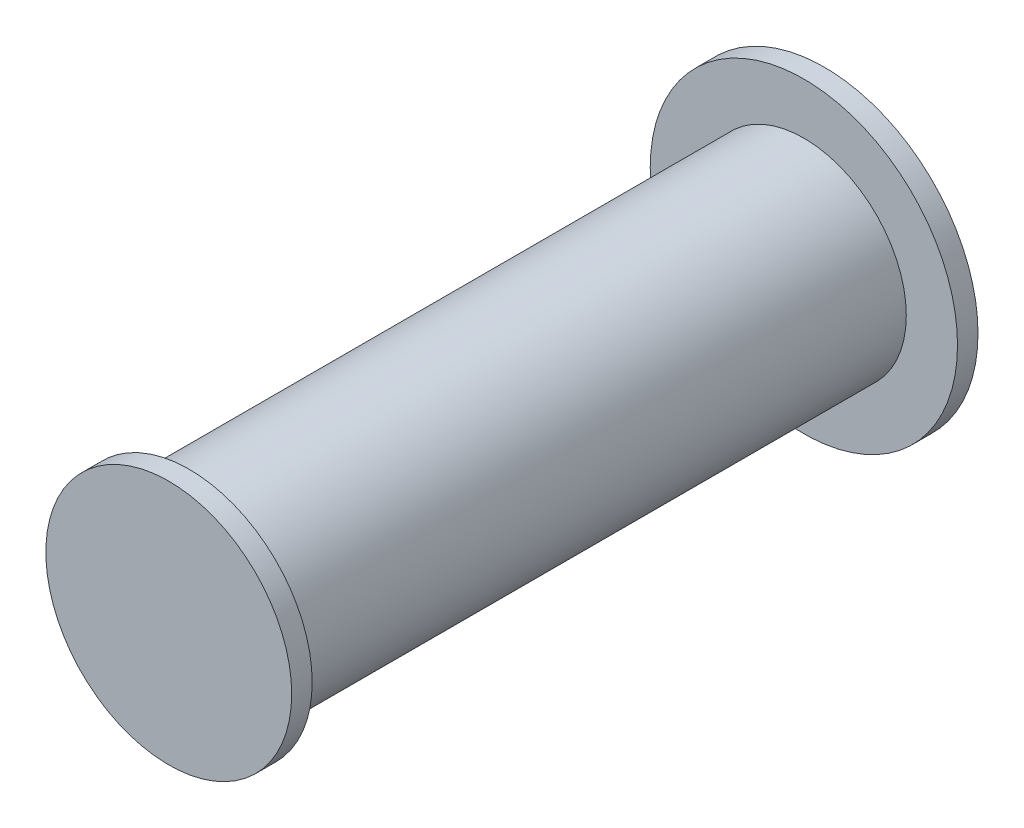
ISO-10303-21;
HEADER;
FILE_DESCRIPTION(('STEP AP214'),'2;1');
FILE_NAME('part.step','',(''),(''),'','','');
FILE_SCHEMA(('AUTOMOTIVE_DESIGN { 1 0 10303 214 1 1 1 1 }'));
ENDSEC;
DATA;
#1=APPLICATION_CONTEXT('core data for automotive mechanical design processes');
#2=APPLICATION_PROTOCOL_DEFINITION('international standard','automotive_design',2000,#1);
#3=PRODUCT_CONTEXT('',#1,'mechanical');
#4=PRODUCT('Part','Part','',(#3));
#5=PRODUCT_RELATED_PRODUCT_CATEGORY('part','',(#4));
#6=PRODUCT_DEFINITION_FORMATION('','',#4);
#7=PRODUCT_DEFINITION_CONTEXT('part definition',#1,'design');
#8=PRODUCT_DEFINITION('design','',#6,#7);
#9=PRODUCT_DEFINITION_SHAPE('','',#8);
#10=(LENGTH_UNIT() NAMED_UNIT(*) SI_UNIT(.MILLI.,.METRE.));
#11=(NAMED_UNIT(*) PLANE_ANGLE_UNIT() SI_UNIT($,.RADIAN.));
#12=(NAMED_UNIT(*) SI_UNIT($,.STERADIAN.) SOLID_ANGLE_UNIT());
#13=UNCERTAINTY_MEASURE_WITH_UNIT(LENGTH_MEASURE(1.E-05),#10,'distance_accuracy_value','');
#14=(GEOMETRIC_REPRESENTATION_CONTEXT(3) GLOBAL_UNCERTAINTY_ASSIGNED_CONTEXT((#13)) GLOBAL_UNIT_ASSIGNED_CONTEXT((#10,
#11,#12)) REPRESENTATION_CONTEXT('',''));
#15=CARTESIAN_POINT('',(0.,0.,0.));
#16=DIRECTION('',(0.,0.,1.));
#17=DIRECTION('',(1.,0.,0.));
#18=AXIS2_PLACEMENT_3D('',#15,#16,#17);
#19=CARTESIAN_POINT('',(0.,0.,10.));
#20=DIRECTION('',(0.,0.,1.));
#21=DIRECTION('',(1.,0.,0.));
#22=AXIS2_PLACEMENT_3D('',#19,#20,#21);
#23=PLANE('',#22);
#24=CARTESIAN_POINT('',(0.,0.,10.));
#25=DIRECTION('',(0.,0.,1.));
#26=DIRECTION('',(1.,0.,0.));
#27=AXIS2_PLACEMENT_3D('',#24,#25,#26);
#28=CIRCLE('',#27,75.);
#29=CARTESIAN_POINT('',(75.,0.,10.));
#30=VERTEX_POINT('',#29);
#31=EDGE_CURVE('E10',#30,#30,#28,.T.);
#32=ORIENTED_EDGE('',*,*,#31,.T.);
#33=EDGE_LOOP('',(#32));
#34=FACE_BOUND('',#33,.T.);
#35=CARTESIAN_POINT('',(0.,0.,10.));
#36=DIRECTION('',(0.,0.,1.));
#37=DIRECTION('',(1.,0.,0.));
#38=AXIS2_PLACEMENT_3D('',#35,#36,#37);
#39=CIRCLE('',#38,50.);
#40=CARTESIAN_POINT('',(50.,0.,10.));
#41=VERTEX_POINT('',#40);
#42=EDGE_CURVE('E43',#41,#41,#39,.T.);
#43=ORIENTED_EDGE('',*,*,#42,.F.);
#44=EDGE_LOOP('',(#43));
#45=FACE_BOUND('',#44,.T.);
#46=ADVANCED_FACE('F30',(#34,#45),#23,.T.);
#47=CARTESIAN_POINT('',(0.,0.,10.));
#48=DIRECTION('',(0.,0.,-1.));
#49=DIRECTION('',(-1.,0.,0.));
#50=AXIS2_PLACEMENT_3D('',#47,#48,#49);
#51=CYLINDRICAL_SURFACE('',#50,75.);
#52=ORIENTED_EDGE('',*,*,#31,.F.);
#53=EDGE_LOOP('',(#52));
#54=FACE_BOUND('',#53,.T.);
#55=CARTESIAN_POINT('',(0.,0.,0.));
#56=DIRECTION('',(0.,0.,1.));
#57=DIRECTION('',(1.,0.,0.));
#58=AXIS2_PLACEMENT_3D('',#55,#56,#57);
#59=CIRCLE('',#58,75.);
#60=CARTESIAN_POINT('',(75.,0.,0.));
#61=VERTEX_POINT('',#60);
#62=EDGE_CURVE('E34',#61,#61,#59,.T.);
#63=ORIENTED_EDGE('',*,*,#62,.T.);
#64=EDGE_LOOP('',(#63));
#65=FACE_BOUND('',#64,.T.);
#66=ADVANCED_FACE('F32',(#54,#65),#51,.T.);
#67=CARTESIAN_POINT('',(0.,0.,0.));
#68=DIRECTION('',(0.,0.,1.));
#69=DIRECTION('',(1.,0.,0.));
#70=AXIS2_PLACEMENT_3D('',#67,#68,#69);
#71=PLANE('',#70);
#72=ORIENTED_EDGE('',*,*,#62,.F.);
#73=EDGE_LOOP('',(#72));
#74=FACE_BOUND('',#73,.T.);
#75=ADVANCED_FACE('F72',(#74),#71,.F.);
#76=CARTESIAN_POINT('',(0.,0.,310.));
#77=DIRECTION('',(0.,0.,-1.));
#78=DIRECTION('',(-1.,0.,0.));
#79=AXIS2_PLACEMENT_3D('',#76,#77,#78);
#80=CYLINDRICAL_SURFACE('',#79,50.);
#81=CARTESIAN_POINT('',(0.,0.,310.));
#82=DIRECTION('',(0.,0.,1.));
#83=DIRECTION('',(1.,0.,0.));
#84=AXIS2_PLACEMENT_3D('',#81,#82,#83);
#85=CIRCLE('',#84,50.);
#86=CARTESIAN_POINT('',(50.,0.,310.));
#87=VERTEX_POINT('',#86);
#88=EDGE_CURVE('E41',#87,#87,#85,.T.);
#89=ORIENTED_EDGE('',*,*,#88,.F.);
#90=EDGE_LOOP('',(#89));
#91=FACE_BOUND('',#90,.T.);
#92=ORIENTED_EDGE('',*,*,#42,.T.);
#93=EDGE_LOOP('',(#92));
#94=FACE_BOUND('',#93,.T.);
#95=ADVANCED_FACE('F66',(#91,#94),#80,.T.);
#96=CARTESIAN_POINT('',(0.,0.,310.));
#97=DIRECTION('',(0.,0.,1.));
#98=DIRECTION('',(1.,0.,0.));
#99=AXIS2_PLACEMENT_3D('',#96,#97,#98);
#100=PLANE('',#99);
#101=CARTESIAN_POINT('',(0.,0.,310.));
#102=DIRECTION('',(0.,0.,1.));
#103=DIRECTION('',(1.,0.,0.));
#104=AXIS2_PLACEMENT_3D('',#101,#102,#103);
#105=CIRCLE('',#104,60.);
#106=CARTESIAN_POINT('',(60.,0.,310.));
#107=VERTEX_POINT('',#106);
#108=EDGE_CURVE('E49',#107,#107,#105,.T.);
#109=ORIENTED_EDGE('',*,*,#108,.F.);
#110=EDGE_LOOP('',(#109));
#111=FACE_BOUND('',#110,.T.);
#112=ORIENTED_EDGE('',*,*,#88,.T.);
#113=EDGE_LOOP('',(#112));
#114=FACE_BOUND('',#113,.T.);
#115=ADVANCED_FACE('F60',(#111,#114),#100,.F.);
#116=CARTESIAN_POINT('',(0.,0.,320.));
#117=DIRECTION('',(0.,0.,-1.));
#118=DIRECTION('',(-1.,0.,0.));
#119=AXIS2_PLACEMENT_3D('',#116,#117,#118);
#120=CYLINDRICAL_SURFACE('',#119,60.);
#121=CARTESIAN_POINT('',(0.,0.,320.));
#122=DIRECTION('',(0.,0.,1.));
#123=DIRECTION('',(1.,0.,0.));
#124=AXIS2_PLACEMENT_3D('',#121,#122,#123);
#125=CIRCLE('',#124,60.);
#126=CARTESIAN_POINT('',(60.,0.,320.));
#127=VERTEX_POINT('',#126);
#128=EDGE_CURVE('E46',#127,#127,#125,.T.);
#129=ORIENTED_EDGE('',*,*,#128,.F.);
#130=EDGE_LOOP('',(#129));
#131=FACE_BOUND('',#130,.T.);
#132=ORIENTED_EDGE('',*,*,#108,.T.);
#133=EDGE_LOOP('',(#132));
#134=FACE_BOUND('',#133,.T.);
#135=ADVANCED_FACE('F57',(#131,#134),#120,.T.);
#136=CARTESIAN_POINT('',(0.,0.,320.));
#137=DIRECTION('',(0.,0.,1.));
#138=DIRECTION('',(1.,0.,0.));
#139=AXIS2_PLACEMENT_3D('',#136,#137,#138);
#140=PLANE('',#139);
#141=ORIENTED_EDGE('',*,*,#128,.T.);
#142=EDGE_LOOP('',(#141));
#143=FACE_BOUND('',#142,.T.);
#144=ADVANCED_FACE('F55',(#143),#140,.T.);
#145=CLOSED_SHELL('',(#46,#66,#75,#95,#115,#135,#144));
#146=MANIFOLD_SOLID_BREP('B2',#145);
#147=ADVANCED_BREP_SHAPE_REPRESENTATION('',(#18,#146),#14);
#148=SHAPE_DEFINITION_REPRESENTATION(#9,#147);
ENDSEC;
END-ISO-10303-21;
